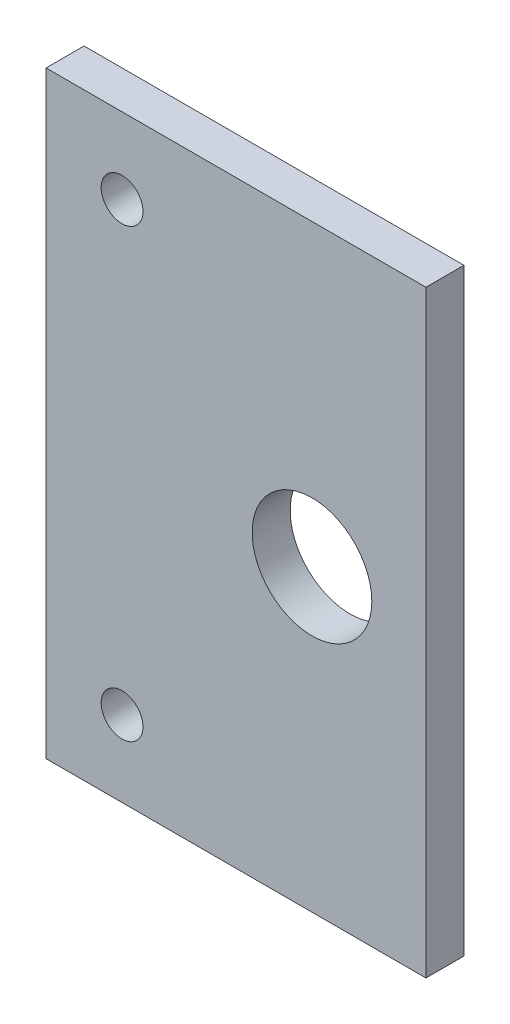
ISO-10303-21;
HEADER;
FILE_DESCRIPTION(('STEP AP214'),'2;1');
FILE_NAME('part.step','',(''),(''),'','','');
FILE_SCHEMA(('AUTOMOTIVE_DESIGN { 1 0 10303 214 1 1 1 1 }'));
ENDSEC;
DATA;
#1=APPLICATION_CONTEXT('core data for automotive mechanical design processes');
#2=APPLICATION_PROTOCOL_DEFINITION('international standard','automotive_design',2000,#1);
#3=PRODUCT_CONTEXT('',#1,'mechanical');
#4=PRODUCT('Part','Part','',(#3));
#5=PRODUCT_RELATED_PRODUCT_CATEGORY('part','',(#4));
#6=PRODUCT_DEFINITION_FORMATION('','',#4);
#7=PRODUCT_DEFINITION_CONTEXT('part definition',#1,'design');
#8=PRODUCT_DEFINITION('design','',#6,#7);
#9=PRODUCT_DEFINITION_SHAPE('','',#8);
#10=(LENGTH_UNIT() NAMED_UNIT(*) SI_UNIT(.MILLI.,.METRE.));
#11=(NAMED_UNIT(*) PLANE_ANGLE_UNIT() SI_UNIT($,.RADIAN.));
#12=(NAMED_UNIT(*) SI_UNIT($,.STERADIAN.) SOLID_ANGLE_UNIT());
#13=UNCERTAINTY_MEASURE_WITH_UNIT(LENGTH_MEASURE(1.E-05),#10,'distance_accuracy_value','');
#14=(GEOMETRIC_REPRESENTATION_CONTEXT(3) GLOBAL_UNCERTAINTY_ASSIGNED_CONTEXT((#13)) GLOBAL_UNIT_ASSIGNED_CONTEXT((#10,
#11,#12)) REPRESENTATION_CONTEXT('',''));
#15=CARTESIAN_POINT('',(0.,0.,0.));
#16=DIRECTION('',(0.,0.,1.));
#17=DIRECTION('',(1.,0.,0.));
#18=AXIS2_PLACEMENT_3D('',#15,#16,#17);
#19=CARTESIAN_POINT('',(0.,0.,6.35));
#20=DIRECTION('',(0.,0.,-1.));
#21=DIRECTION('',(-1.,0.,0.));
#22=AXIS2_PLACEMENT_3D('',#19,#20,#21);
#23=PLANE('',#22);
#24=DIRECTION('',(0.,-1.,0.));
#25=VECTOR('',#24,1.);
#26=CARTESIAN_POINT('',(-31.75,0.,6.35));
#27=LINE('',#26,#25);
#28=CARTESIAN_POINT('',(-31.75,100.,6.35));
#29=VERTEX_POINT('',#28);
#30=CARTESIAN_POINT('',(-31.75,0.,6.35));
#31=VERTEX_POINT('',#30);
#32=EDGE_CURVE('E92',#29,#31,#27,.T.);
#33=ORIENTED_EDGE('',*,*,#32,.T.);
#34=DIRECTION('',(1.,0.,0.));
#35=VECTOR('',#34,1.);
#36=CARTESIAN_POINT('',(-31.75,0.,6.35));
#37=LINE('',#36,#35);
#38=CARTESIAN_POINT('',(31.75,0.,6.35));
#39=VERTEX_POINT('',#38);
#40=EDGE_CURVE('E87',#31,#39,#37,.T.);
#41=ORIENTED_EDGE('',*,*,#40,.T.);
#42=DIRECTION('',(0.,1.,0.));
#43=VECTOR('',#42,1.);
#44=CARTESIAN_POINT('',(31.75,0.,6.35));
#45=LINE('',#44,#43);
#46=CARTESIAN_POINT('',(31.75,100.,6.35));
#47=VERTEX_POINT('',#46);
#48=EDGE_CURVE('E90',#39,#47,#45,.T.);
#49=ORIENTED_EDGE('',*,*,#48,.T.);
#50=DIRECTION('',(-1.,0.,0.));
#51=VECTOR('',#50,1.);
#52=CARTESIAN_POINT('',(-31.75,100.,6.35));
#53=LINE('',#52,#51);
#54=EDGE_CURVE('E57',#47,#29,#53,.T.);
#55=ORIENTED_EDGE('',*,*,#54,.T.);
#56=EDGE_LOOP('',(#33,#41,#49,#55));
#57=FACE_BOUND('',#56,.T.);
#58=CARTESIAN_POINT('',(-19.05,12.7,6.35));
#59=DIRECTION('',(0.,0.,1.));
#60=DIRECTION('',(1.,0.,0.));
#61=AXIS2_PLACEMENT_3D('',#58,#59,#60);
#62=CIRCLE('',#61,3.5);
#63=CARTESIAN_POINT('',(-15.55,12.7,6.35));
#64=VERTEX_POINT('',#63);
#65=EDGE_CURVE('E112',#64,#64,#62,.T.);
#66=ORIENTED_EDGE('',*,*,#65,.F.);
#67=EDGE_LOOP('',(#66));
#68=FACE_BOUND('',#67,.T.);
#69=CARTESIAN_POINT('',(-19.05,87.3,6.35));
#70=DIRECTION('',(0.,0.,1.));
#71=DIRECTION('',(-1.,0.,0.));
#72=AXIS2_PLACEMENT_3D('',#69,#70,#71);
#73=CIRCLE('',#72,3.5);
#74=CARTESIAN_POINT('',(-22.55,87.3,6.35));
#75=VERTEX_POINT('',#74);
#76=EDGE_CURVE('E134',#75,#75,#73,.T.);
#77=ORIENTED_EDGE('',*,*,#76,.F.);
#78=EDGE_LOOP('',(#77));
#79=FACE_BOUND('',#78,.T.);
#80=CARTESIAN_POINT('',(12.7,50.,6.35));
#81=DIRECTION('',(0.,0.,1.));
#82=DIRECTION('',(1.,0.,0.));
#83=AXIS2_PLACEMENT_3D('',#80,#81,#82);
#84=CIRCLE('',#83,10.);
#85=CARTESIAN_POINT('',(22.7,50.,6.35));
#86=VERTEX_POINT('',#85);
#87=EDGE_CURVE('E142',#86,#86,#84,.T.);
#88=ORIENTED_EDGE('',*,*,#87,.F.);
#89=EDGE_LOOP('',(#88));
#90=FACE_BOUND('',#89,.T.);
#91=ADVANCED_FACE('F39',(#57,#68,#79,#90),#23,.F.);
#92=CARTESIAN_POINT('',(0.,0.,0.));
#93=DIRECTION('',(0.,0.,-1.));
#94=DIRECTION('',(-1.,0.,0.));
#95=AXIS2_PLACEMENT_3D('',#92,#93,#94);
#96=PLANE('',#95);
#97=CARTESIAN_POINT('',(-19.05,87.3,0.));
#98=DIRECTION('',(0.,0.,1.));
#99=DIRECTION('',(-1.,0.,0.));
#100=AXIS2_PLACEMENT_3D('',#97,#98,#99);
#101=CIRCLE('',#100,3.5);
#102=CARTESIAN_POINT('',(-22.55,87.3,0.));
#103=VERTEX_POINT('',#102);
#104=EDGE_CURVE('E138',#103,#103,#101,.T.);
#105=ORIENTED_EDGE('',*,*,#104,.T.);
#106=EDGE_LOOP('',(#105));
#107=FACE_BOUND('',#106,.T.);
#108=DIRECTION('',(0.,-1.,0.));
#109=VECTOR('',#108,1.);
#110=CARTESIAN_POINT('',(-31.75,0.,0.));
#111=LINE('',#110,#109);
#112=CARTESIAN_POINT('',(-31.75,100.,0.));
#113=VERTEX_POINT('',#112);
#114=CARTESIAN_POINT('',(-31.75,0.,0.));
#115=VERTEX_POINT('',#114);
#116=EDGE_CURVE('E108',#113,#115,#111,.T.);
#117=ORIENTED_EDGE('',*,*,#116,.F.);
#118=DIRECTION('',(-1.,0.,0.));
#119=VECTOR('',#118,1.);
#120=CARTESIAN_POINT('',(-31.75,100.,0.));
#121=LINE('',#120,#119);
#122=CARTESIAN_POINT('',(31.75,100.,0.));
#123=VERTEX_POINT('',#122);
#124=EDGE_CURVE('E80',#123,#113,#121,.T.);
#125=ORIENTED_EDGE('',*,*,#124,.F.);
#126=DIRECTION('',(0.,1.,0.));
#127=VECTOR('',#126,1.);
#128=CARTESIAN_POINT('',(31.75,0.,0.));
#129=LINE('',#128,#127);
#130=CARTESIAN_POINT('',(31.75,0.,0.));
#131=VERTEX_POINT('',#130);
#132=EDGE_CURVE('E74',#131,#123,#129,.T.);
#133=ORIENTED_EDGE('',*,*,#132,.F.);
#134=DIRECTION('',(1.,0.,0.));
#135=VECTOR('',#134,1.);
#136=CARTESIAN_POINT('',(-31.75,0.,0.));
#137=LINE('',#136,#135);
#138=EDGE_CURVE('E97',#115,#131,#137,.T.);
#139=ORIENTED_EDGE('',*,*,#138,.F.);
#140=EDGE_LOOP('',(#117,#125,#133,#139));
#141=FACE_BOUND('',#140,.T.);
#142=CARTESIAN_POINT('',(-19.05,12.7,0.));
#143=DIRECTION('',(0.,0.,1.));
#144=DIRECTION('',(1.,0.,0.));
#145=AXIS2_PLACEMENT_3D('',#142,#143,#144);
#146=CIRCLE('',#145,3.5);
#147=CARTESIAN_POINT('',(-15.55,12.7,0.));
#148=VERTEX_POINT('',#147);
#149=EDGE_CURVE('E130',#148,#148,#146,.T.);
#150=ORIENTED_EDGE('',*,*,#149,.T.);
#151=EDGE_LOOP('',(#150));
#152=FACE_BOUND('',#151,.T.);
#153=CARTESIAN_POINT('',(12.7,50.,0.));
#154=DIRECTION('',(0.,0.,1.));
#155=DIRECTION('',(1.,0.,0.));
#156=AXIS2_PLACEMENT_3D('',#153,#154,#155);
#157=CIRCLE('',#156,10.);
#158=CARTESIAN_POINT('',(22.7,50.,0.));
#159=VERTEX_POINT('',#158);
#160=EDGE_CURVE('E146',#159,#159,#157,.T.);
#161=ORIENTED_EDGE('',*,*,#160,.T.);
#162=EDGE_LOOP('',(#161));
#163=FACE_BOUND('',#162,.T.);
#164=ADVANCED_FACE('F125',(#107,#141,#152,#163),#96,.T.);
#165=CARTESIAN_POINT('',(-31.75,0.,6.35));
#166=DIRECTION('',(1.,0.,0.));
#167=DIRECTION('',(0.,0.,-1.));
#168=AXIS2_PLACEMENT_3D('',#165,#166,#167);
#169=PLANE('',#168);
#170=ORIENTED_EDGE('',*,*,#116,.T.);
#171=DIRECTION('',(0.,0.,-1.));
#172=VECTOR('',#171,1.);
#173=CARTESIAN_POINT('',(-31.75,0.,6.35));
#174=LINE('',#173,#172);
#175=EDGE_CURVE('E11',#31,#115,#174,.T.);
#176=ORIENTED_EDGE('',*,*,#175,.F.);
#177=ORIENTED_EDGE('',*,*,#32,.F.);
#178=DIRECTION('',(0.,0.,-1.));
#179=VECTOR('',#178,1.);
#180=CARTESIAN_POINT('',(-31.75,100.,6.35));
#181=LINE('',#180,#179);
#182=EDGE_CURVE('E104',#29,#113,#181,.T.);
#183=ORIENTED_EDGE('',*,*,#182,.T.);
#184=EDGE_LOOP('',(#170,#176,#177,#183));
#185=FACE_BOUND('',#184,.T.);
#186=ADVANCED_FACE('F41',(#185),#169,.F.);
#187=CARTESIAN_POINT('',(-31.75,0.,6.35));
#188=DIRECTION('',(0.,1.,0.));
#189=DIRECTION('',(-1.,0.,0.));
#190=AXIS2_PLACEMENT_3D('',#187,#188,#189);
#191=PLANE('',#190);
#192=ORIENTED_EDGE('',*,*,#138,.T.);
#193=DIRECTION('',(0.,0.,-1.));
#194=VECTOR('',#193,1.);
#195=CARTESIAN_POINT('',(31.75,0.,6.35));
#196=LINE('',#195,#194);
#197=EDGE_CURVE('E49',#39,#131,#196,.T.);
#198=ORIENTED_EDGE('',*,*,#197,.F.);
#199=ORIENTED_EDGE('',*,*,#40,.F.);
#200=ORIENTED_EDGE('',*,*,#175,.T.);
#201=EDGE_LOOP('',(#192,#198,#199,#200));
#202=FACE_BOUND('',#201,.T.);
#203=ADVANCED_FACE('F96',(#202),#191,.F.);
#204=CARTESIAN_POINT('',(31.75,0.,6.35));
#205=DIRECTION('',(-1.,0.,0.));
#206=DIRECTION('',(0.,0.,1.));
#207=AXIS2_PLACEMENT_3D('',#204,#205,#206);
#208=PLANE('',#207);
#209=ORIENTED_EDGE('',*,*,#132,.T.);
#210=DIRECTION('',(0.,0.,-1.));
#211=VECTOR('',#210,1.);
#212=CARTESIAN_POINT('',(31.75,100.,6.35));
#213=LINE('',#212,#211);
#214=EDGE_CURVE('E99',#47,#123,#213,.T.);
#215=ORIENTED_EDGE('',*,*,#214,.F.);
#216=ORIENTED_EDGE('',*,*,#48,.F.);
#217=ORIENTED_EDGE('',*,*,#197,.T.);
#218=EDGE_LOOP('',(#209,#215,#216,#217));
#219=FACE_BOUND('',#218,.T.);
#220=ADVANCED_FACE('F100',(#219),#208,.F.);
#221=CARTESIAN_POINT('',(-31.75,100.,6.35));
#222=DIRECTION('',(0.,-1.,0.));
#223=DIRECTION('',(0.,0.,-1.));
#224=AXIS2_PLACEMENT_3D('',#221,#222,#223);
#225=PLANE('',#224);
#226=ORIENTED_EDGE('',*,*,#124,.T.);
#227=ORIENTED_EDGE('',*,*,#182,.F.);
#228=ORIENTED_EDGE('',*,*,#54,.F.);
#229=ORIENTED_EDGE('',*,*,#214,.T.);
#230=EDGE_LOOP('',(#226,#227,#228,#229));
#231=FACE_BOUND('',#230,.T.);
#232=ADVANCED_FACE('F122',(#231),#225,.F.);
#233=CARTESIAN_POINT('',(-19.05,12.7,6.35));
#234=DIRECTION('',(0.,0.,-1.));
#235=DIRECTION('',(-1.,0.,0.));
#236=AXIS2_PLACEMENT_3D('',#233,#234,#235);
#237=CYLINDRICAL_SURFACE('',#236,3.5);
#238=ORIENTED_EDGE('',*,*,#65,.T.);
#239=EDGE_LOOP('',(#238));
#240=FACE_BOUND('',#239,.T.);
#241=ORIENTED_EDGE('',*,*,#149,.F.);
#242=EDGE_LOOP('',(#241));
#243=FACE_BOUND('',#242,.T.);
#244=ADVANCED_FACE('F165',(#240,#243),#237,.F.);
#245=CARTESIAN_POINT('',(-19.05,87.3,6.35));
#246=DIRECTION('',(0.,0.,-1.));
#247=DIRECTION('',(-1.,0.,0.));
#248=AXIS2_PLACEMENT_3D('',#245,#246,#247);
#249=CYLINDRICAL_SURFACE('',#248,3.5);
#250=ORIENTED_EDGE('',*,*,#76,.T.);
#251=EDGE_LOOP('',(#250));
#252=FACE_BOUND('',#251,.T.);
#253=ORIENTED_EDGE('',*,*,#104,.F.);
#254=EDGE_LOOP('',(#253));
#255=FACE_BOUND('',#254,.T.);
#256=ADVANCED_FACE('F211',(#252,#255),#249,.F.);
#257=CARTESIAN_POINT('',(12.7,50.,6.35));
#258=DIRECTION('',(0.,0.,-1.));
#259=DIRECTION('',(-1.,0.,0.));
#260=AXIS2_PLACEMENT_3D('',#257,#258,#259);
#261=CYLINDRICAL_SURFACE('',#260,10.);
#262=ORIENTED_EDGE('',*,*,#87,.T.);
#263=EDGE_LOOP('',(#262));
#264=FACE_BOUND('',#263,.T.);
#265=ORIENTED_EDGE('',*,*,#160,.F.);
#266=EDGE_LOOP('',(#265));
#267=FACE_BOUND('',#266,.T.);
#268=ADVANCED_FACE('F154',(#264,#267),#261,.F.);
#269=CLOSED_SHELL('',(#91,#164,#186,#203,#220,#232,#244,#256,#268));
#270=MANIFOLD_SOLID_BREP('B2',#269);
#271=ADVANCED_BREP_SHAPE_REPRESENTATION('',(#18,#270),#14);
#272=SHAPE_DEFINITION_REPRESENTATION(#9,#271);
ENDSEC;
END-ISO-10303-21;
